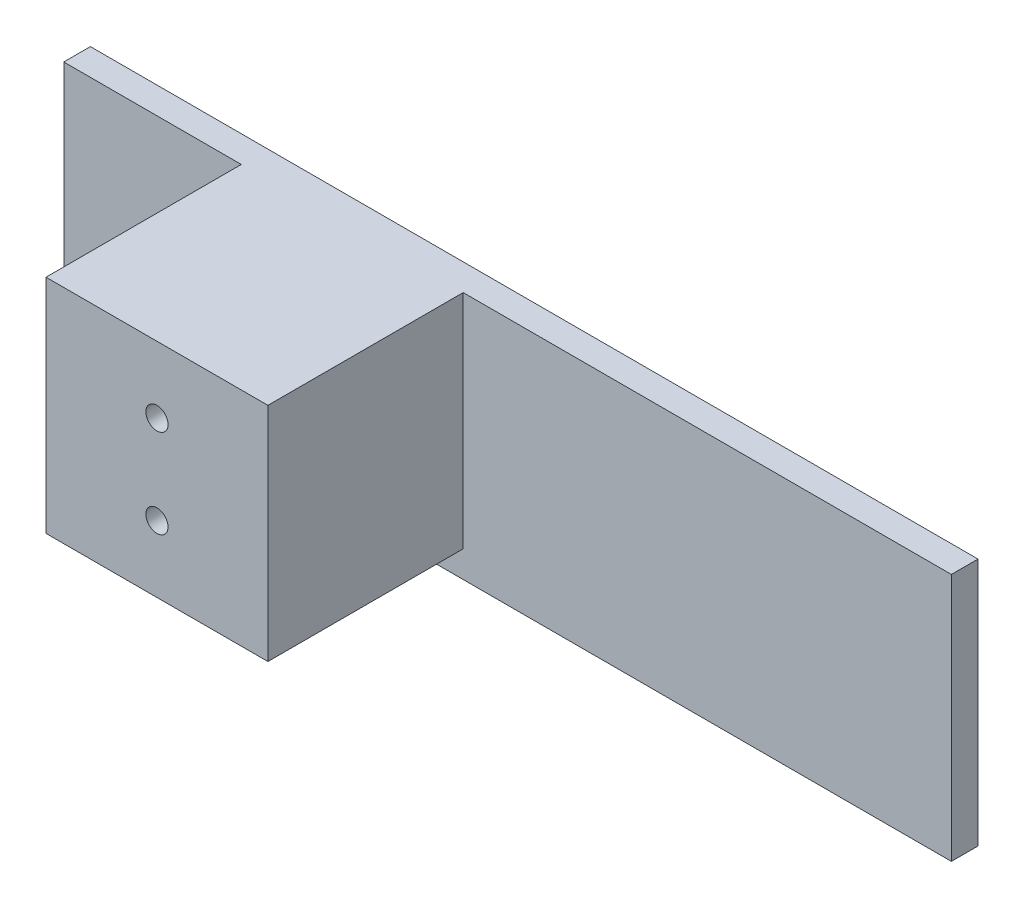
ISO-10303-21;
HEADER;
FILE_DESCRIPTION(('STEP AP214'),'2;1');
FILE_NAME('part.step','',(''),(''),'','','');
FILE_SCHEMA(('AUTOMOTIVE_DESIGN { 1 0 10303 214 1 1 1 1 }'));
ENDSEC;
DATA;
#1=APPLICATION_CONTEXT('core data for automotive mechanical design processes');
#2=APPLICATION_PROTOCOL_DEFINITION('international standard','automotive_design',2000,#1);
#3=PRODUCT_CONTEXT('',#1,'mechanical');
#4=PRODUCT('Part','Part','',(#3));
#5=PRODUCT_RELATED_PRODUCT_CATEGORY('part','',(#4));
#6=PRODUCT_DEFINITION_FORMATION('','',#4);
#7=PRODUCT_DEFINITION_CONTEXT('part definition',#1,'design');
#8=PRODUCT_DEFINITION('design','',#6,#7);
#9=PRODUCT_DEFINITION_SHAPE('','',#8);
#10=(LENGTH_UNIT() NAMED_UNIT(*) SI_UNIT(.MILLI.,.METRE.));
#11=(NAMED_UNIT(*) PLANE_ANGLE_UNIT() SI_UNIT($,.RADIAN.));
#12=(NAMED_UNIT(*) SI_UNIT($,.STERADIAN.) SOLID_ANGLE_UNIT());
#13=UNCERTAINTY_MEASURE_WITH_UNIT(LENGTH_MEASURE(1.E-05),#10,'distance_accuracy_value','');
#14=(GEOMETRIC_REPRESENTATION_CONTEXT(3) GLOBAL_UNCERTAINTY_ASSIGNED_CONTEXT((#13)) GLOBAL_UNIT_ASSIGNED_CONTEXT((#10,
#11,#12)) REPRESENTATION_CONTEXT('',''));
#15=CARTESIAN_POINT('',(0.,0.,0.));
#16=DIRECTION('',(0.,0.,1.));
#17=DIRECTION('',(1.,0.,0.));
#18=AXIS2_PLACEMENT_3D('',#15,#16,#17);
#19=CARTESIAN_POINT('',(-17.2348484848485,13.2575757575758,22.));
#20=DIRECTION('',(1.,0.,0.));
#21=DIRECTION('',(0.,0.,-1.));
#22=AXIS2_PLACEMENT_3D('',#19,#20,#21);
#23=PLANE('',#22);
#24=DIRECTION('',(0.,-1.,0.));
#25=VECTOR('',#24,1.);
#26=CARTESIAN_POINT('',(-17.2348484848485,13.2575757575758,0.));
#27=LINE('',#26,#25);
#28=CARTESIAN_POINT('',(-17.2348484848485,13.2575757575758,0.));
#29=VERTEX_POINT('',#28);
#30=CARTESIAN_POINT('',(-17.2348484848485,-11.7424242424242,0.));
#31=VERTEX_POINT('',#30);
#32=EDGE_CURVE('E133',#29,#31,#27,.T.);
#33=ORIENTED_EDGE('',*,*,#32,.T.);
#34=DIRECTION('',(0.,0.,-1.));
#35=VECTOR('',#34,1.);
#36=CARTESIAN_POINT('',(-17.2348484848485,-11.7424242424242,22.));
#37=LINE('',#36,#35);
#38=CARTESIAN_POINT('',(-17.2348484848485,-11.7424242424242,22.));
#39=VERTEX_POINT('',#38);
#40=EDGE_CURVE('E11',#39,#31,#37,.T.);
#41=ORIENTED_EDGE('',*,*,#40,.F.);
#42=DIRECTION('',(0.,-1.,0.));
#43=VECTOR('',#42,1.);
#44=CARTESIAN_POINT('',(-17.2348484848485,13.2575757575758,22.));
#45=LINE('',#44,#43);
#46=CARTESIAN_POINT('',(-17.2348484848485,13.2575757575758,22.));
#47=VERTEX_POINT('',#46);
#48=EDGE_CURVE('E139',#47,#39,#45,.T.);
#49=ORIENTED_EDGE('',*,*,#48,.F.);
#50=DIRECTION('',(0.,0.,-1.));
#51=VECTOR('',#50,1.);
#52=CARTESIAN_POINT('',(-17.2348484848485,13.2575757575758,22.));
#53=LINE('',#52,#51);
#54=EDGE_CURVE('E147',#47,#29,#53,.T.);
#55=ORIENTED_EDGE('',*,*,#54,.T.);
#56=EDGE_LOOP('',(#33,#41,#49,#55));
#57=FACE_BOUND('',#56,.T.);
#58=ADVANCED_FACE('F34',(#57),#23,.F.);
#59=CARTESIAN_POINT('',(-17.2348484848485,-11.7424242424242,22.));
#60=DIRECTION('',(0.,1.,0.));
#61=DIRECTION('',(0.,0.,1.));
#62=AXIS2_PLACEMENT_3D('',#59,#60,#61);
#63=PLANE('',#62);
#64=DIRECTION('',(1.,0.,0.));
#65=VECTOR('',#64,1.);
#66=CARTESIAN_POINT('',(-17.2348484848485,-11.7424242424242,0.));
#67=LINE('',#66,#65);
#68=CARTESIAN_POINT('',(7.76515151515152,-11.7424242424242,0.));
#69=VERTEX_POINT('',#68);
#70=EDGE_CURVE('E150',#31,#69,#67,.T.);
#71=ORIENTED_EDGE('',*,*,#70,.T.);
#72=DIRECTION('',(0.,0.,-1.));
#73=VECTOR('',#72,1.);
#74=CARTESIAN_POINT('',(7.76515151515152,-11.7424242424242,22.));
#75=LINE('',#74,#73);
#76=CARTESIAN_POINT('',(7.76515151515152,-11.7424242424242,22.));
#77=VERTEX_POINT('',#76);
#78=EDGE_CURVE('E42',#77,#69,#75,.T.);
#79=ORIENTED_EDGE('',*,*,#78,.F.);
#80=DIRECTION('',(1.,0.,0.));
#81=VECTOR('',#80,1.);
#82=CARTESIAN_POINT('',(-17.2348484848485,-11.7424242424242,22.));
#83=LINE('',#82,#81);
#84=EDGE_CURVE('E141',#39,#77,#83,.T.);
#85=ORIENTED_EDGE('',*,*,#84,.F.);
#86=ORIENTED_EDGE('',*,*,#40,.T.);
#87=EDGE_LOOP('',(#71,#79,#85,#86));
#88=FACE_BOUND('',#87,.T.);
#89=ADVANCED_FACE('F166',(#88),#63,.F.);
#90=CARTESIAN_POINT('',(7.76515151515151,13.2575757575758,22.));
#91=DIRECTION('',(-1.,0.,0.));
#92=DIRECTION('',(0.,-1.,0.));
#93=AXIS2_PLACEMENT_3D('',#90,#91,#92);
#94=PLANE('',#93);
#95=DIRECTION('',(0.,1.,0.));
#96=VECTOR('',#95,1.);
#97=CARTESIAN_POINT('',(7.76515151515151,13.2575757575758,0.));
#98=LINE('',#97,#96);
#99=CARTESIAN_POINT('',(7.76515151515152,13.2575757575757,0.));
#100=VERTEX_POINT('',#99);
#101=EDGE_CURVE('E142',#69,#100,#98,.T.);
#102=ORIENTED_EDGE('',*,*,#101,.T.);
#103=DIRECTION('',(0.,0.,-1.));
#104=VECTOR('',#103,1.);
#105=CARTESIAN_POINT('',(7.76515151515151,13.2575757575758,22.));
#106=LINE('',#105,#104);
#107=CARTESIAN_POINT('',(7.76515151515151,13.2575757575758,22.));
#108=VERTEX_POINT('',#107);
#109=EDGE_CURVE('E157',#108,#100,#106,.T.);
#110=ORIENTED_EDGE('',*,*,#109,.F.);
#111=DIRECTION('',(0.,1.,0.));
#112=VECTOR('',#111,1.);
#113=CARTESIAN_POINT('',(7.76515151515151,13.2575757575758,22.));
#114=LINE('',#113,#112);
#115=EDGE_CURVE('E144',#77,#108,#114,.T.);
#116=ORIENTED_EDGE('',*,*,#115,.F.);
#117=ORIENTED_EDGE('',*,*,#78,.T.);
#118=EDGE_LOOP('',(#102,#110,#116,#117));
#119=FACE_BOUND('',#118,.T.);
#120=ADVANCED_FACE('F162',(#119),#94,.F.);
#121=CARTESIAN_POINT('',(-17.2348484848485,13.2575757575758,22.));
#122=DIRECTION('',(0.,-1.,0.));
#123=DIRECTION('',(0.,0.,-1.));
#124=AXIS2_PLACEMENT_3D('',#121,#122,#123);
#125=PLANE('',#124);
#126=ORIENTED_EDGE('',*,*,#109,.T.);
#127=DIRECTION('',(1.,0.,0.));
#128=VECTOR('',#127,1.);
#129=CARTESIAN_POINT('',(-37.2348484848485,13.2575757575758,0.));
#130=LINE('',#129,#128);
#131=CARTESIAN_POINT('',(62.7651515151515,13.2575757575757,0.));
#132=VERTEX_POINT('',#131);
#133=EDGE_CURVE('E171',#100,#132,#130,.T.);
#134=ORIENTED_EDGE('',*,*,#133,.T.);
#135=DIRECTION('',(0.,0.,1.));
#136=VECTOR('',#135,1.);
#137=CARTESIAN_POINT('',(62.7651515151515,13.2575757575757,-3.));
#138=LINE('',#137,#136);
#139=CARTESIAN_POINT('',(62.7651515151515,13.2575757575757,-3.));
#140=VERTEX_POINT('',#139);
#141=EDGE_CURVE('E103',#140,#132,#138,.T.);
#142=ORIENTED_EDGE('',*,*,#141,.F.);
#143=DIRECTION('',(1.,0.,0.));
#144=VECTOR('',#143,1.);
#145=CARTESIAN_POINT('',(-37.2348484848485,13.2575757575758,-3.));
#146=LINE('',#145,#144);
#147=CARTESIAN_POINT('',(-37.2348484848485,13.2575757575758,-3.));
#148=VERTEX_POINT('',#147);
#149=EDGE_CURVE('E94',#148,#140,#146,.T.);
#150=ORIENTED_EDGE('',*,*,#149,.F.);
#151=DIRECTION('',(0.,0.,1.));
#152=VECTOR('',#151,1.);
#153=CARTESIAN_POINT('',(-37.2348484848485,13.2575757575758,-3.));
#154=LINE('',#153,#152);
#155=CARTESIAN_POINT('',(-37.2348484848485,13.2575757575758,0.));
#156=VERTEX_POINT('',#155);
#157=EDGE_CURVE('E100',#148,#156,#154,.T.);
#158=ORIENTED_EDGE('',*,*,#157,.T.);
#159=EDGE_CURVE('E174',#156,#29,#130,.T.);
#160=ORIENTED_EDGE('',*,*,#159,.T.);
#161=ORIENTED_EDGE('',*,*,#54,.F.);
#162=DIRECTION('',(-1.,0.,0.));
#163=VECTOR('',#162,1.);
#164=CARTESIAN_POINT('',(-17.2348484848485,13.2575757575758,22.));
#165=LINE('',#164,#163);
#166=EDGE_CURVE('E49',#108,#47,#165,.T.);
#167=ORIENTED_EDGE('',*,*,#166,.F.);
#168=EDGE_LOOP('',(#126,#134,#142,#150,#158,#160,#161,#167));
#169=FACE_BOUND('',#168,.T.);
#170=ADVANCED_FACE('F97',(#169),#125,.F.);
#171=CARTESIAN_POINT('',(0.,0.,22.));
#172=DIRECTION('',(0.,0.,1.));
#173=DIRECTION('',(1.,0.,0.));
#174=AXIS2_PLACEMENT_3D('',#171,#172,#173);
#175=PLANE('',#174);
#176=CARTESIAN_POINT('',(-4.73484848484849,5.75757575757576,22.));
#177=DIRECTION('',(0.,0.,1.));
#178=DIRECTION('',(1.,0.,0.));
#179=AXIS2_PLACEMENT_3D('',#176,#177,#178);
#180=CIRCLE('',#179,1.25);
#181=CARTESIAN_POINT('',(-3.48484848484849,5.75757575757576,22.));
#182=VERTEX_POINT('',#181);
#183=EDGE_CURVE('E134',#182,#182,#180,.T.);
#184=ORIENTED_EDGE('',*,*,#183,.F.);
#185=EDGE_LOOP('',(#184));
#186=FACE_BOUND('',#185,.T.);
#187=CARTESIAN_POINT('',(-4.73484848484848,-4.24242424242424,22.));
#188=DIRECTION('',(0.,0.,1.));
#189=DIRECTION('',(1.,0.,0.));
#190=AXIS2_PLACEMENT_3D('',#187,#188,#189);
#191=CIRCLE('',#190,1.25);
#192=CARTESIAN_POINT('',(-3.48484848484848,-4.24242424242424,22.));
#193=VERTEX_POINT('',#192);
#194=EDGE_CURVE('E121',#193,#193,#191,.T.);
#195=ORIENTED_EDGE('',*,*,#194,.F.);
#196=EDGE_LOOP('',(#195));
#197=FACE_BOUND('',#196,.T.);
#198=ORIENTED_EDGE('',*,*,#48,.T.);
#199=ORIENTED_EDGE('',*,*,#84,.T.);
#200=ORIENTED_EDGE('',*,*,#115,.T.);
#201=ORIENTED_EDGE('',*,*,#166,.T.);
#202=EDGE_LOOP('',(#198,#199,#200,#201));
#203=FACE_BOUND('',#202,.T.);
#204=ADVANCED_FACE('F189',(#186,#197,#203),#175,.T.);
#205=CARTESIAN_POINT('',(-4.73484848484848,-4.24242424242424,7.));
#206=DIRECTION('',(0.,0.,1.));
#207=DIRECTION('',(1.,0.,0.));
#208=AXIS2_PLACEMENT_3D('',#205,#206,#207);
#209=CYLINDRICAL_SURFACE('',#208,1.25);
#210=CARTESIAN_POINT('',(-4.73484848484848,-4.24242424242424,7.));
#211=DIRECTION('',(0.,0.,1.));
#212=DIRECTION('',(1.,0.,0.));
#213=AXIS2_PLACEMENT_3D('',#210,#211,#212);
#214=CIRCLE('',#213,1.25);
#215=CARTESIAN_POINT('',(-3.48484848484848,-4.24242424242424,7.));
#216=VERTEX_POINT('',#215);
#217=EDGE_CURVE('E124',#216,#216,#214,.T.);
#218=ORIENTED_EDGE('',*,*,#217,.F.);
#219=EDGE_LOOP('',(#218));
#220=FACE_BOUND('',#219,.T.);
#221=ORIENTED_EDGE('',*,*,#194,.T.);
#222=EDGE_LOOP('',(#221));
#223=FACE_BOUND('',#222,.T.);
#224=ADVANCED_FACE('F191',(#220,#223),#209,.F.);
#225=CARTESIAN_POINT('',(-4.73484848484848,-4.24242424242424,7.));
#226=DIRECTION('',(0.,0.,1.));
#227=DIRECTION('',(1.,0.,0.));
#228=AXIS2_PLACEMENT_3D('',#225,#226,#227);
#229=PLANE('',#228);
#230=ORIENTED_EDGE('',*,*,#217,.T.);
#231=EDGE_LOOP('',(#230));
#232=FACE_BOUND('',#231,.T.);
#233=ADVANCED_FACE('F198',(#232),#229,.T.);
#234=CARTESIAN_POINT('',(-4.73484848484849,5.75757575757576,7.));
#235=DIRECTION('',(0.,0.,1.));
#236=DIRECTION('',(1.,0.,0.));
#237=AXIS2_PLACEMENT_3D('',#234,#235,#236);
#238=CYLINDRICAL_SURFACE('',#237,1.25);
#239=CARTESIAN_POINT('',(-4.73484848484849,5.75757575757576,7.));
#240=DIRECTION('',(0.,0.,1.));
#241=DIRECTION('',(1.,0.,0.));
#242=AXIS2_PLACEMENT_3D('',#239,#240,#241);
#243=CIRCLE('',#242,1.25);
#244=CARTESIAN_POINT('',(-3.48484848484849,5.75757575757576,7.));
#245=VERTEX_POINT('',#244);
#246=EDGE_CURVE('E130',#245,#245,#243,.T.);
#247=ORIENTED_EDGE('',*,*,#246,.F.);
#248=EDGE_LOOP('',(#247));
#249=FACE_BOUND('',#248,.T.);
#250=ORIENTED_EDGE('',*,*,#183,.T.);
#251=EDGE_LOOP('',(#250));
#252=FACE_BOUND('',#251,.T.);
#253=ADVANCED_FACE('F269',(#249,#252),#238,.F.);
#254=CARTESIAN_POINT('',(-4.73484848484849,5.75757575757576,7.));
#255=DIRECTION('',(0.,0.,1.));
#256=DIRECTION('',(1.,0.,0.));
#257=AXIS2_PLACEMENT_3D('',#254,#255,#256);
#258=PLANE('',#257);
#259=ORIENTED_EDGE('',*,*,#246,.T.);
#260=EDGE_LOOP('',(#259));
#261=FACE_BOUND('',#260,.T.);
#262=ADVANCED_FACE('F230',(#261),#258,.T.);
#263=CARTESIAN_POINT('',(-37.2348484848485,-14.7424242424242,-3.));
#264=DIRECTION('',(1.,0.,0.));
#265=DIRECTION('',(0.,1.,0.));
#266=AXIS2_PLACEMENT_3D('',#263,#264,#265);
#267=PLANE('',#266);
#268=DIRECTION('',(0.,1.,0.));
#269=VECTOR('',#268,1.);
#270=CARTESIAN_POINT('',(-37.2348484848485,-14.7424242424242,0.));
#271=LINE('',#270,#269);
#272=CARTESIAN_POINT('',(-37.2348484848485,-14.7424242424242,0.));
#273=VERTEX_POINT('',#272);
#274=EDGE_CURVE('E120',#273,#156,#271,.T.);
#275=ORIENTED_EDGE('',*,*,#274,.T.);
#276=ORIENTED_EDGE('',*,*,#157,.F.);
#277=DIRECTION('',(0.,1.,0.));
#278=VECTOR('',#277,1.);
#279=CARTESIAN_POINT('',(-37.2348484848485,-14.7424242424242,-3.));
#280=LINE('',#279,#278);
#281=CARTESIAN_POINT('',(-37.2348484848485,-14.7424242424242,-3.));
#282=VERTEX_POINT('',#281);
#283=EDGE_CURVE('E107',#282,#148,#280,.T.);
#284=ORIENTED_EDGE('',*,*,#283,.F.);
#285=DIRECTION('',(0.,0.,1.));
#286=VECTOR('',#285,1.);
#287=CARTESIAN_POINT('',(-37.2348484848485,-14.7424242424242,-3.));
#288=LINE('',#287,#286);
#289=EDGE_CURVE('E181',#282,#273,#288,.T.);
#290=ORIENTED_EDGE('',*,*,#289,.T.);
#291=EDGE_LOOP('',(#275,#276,#284,#290));
#292=FACE_BOUND('',#291,.T.);
#293=ADVANCED_FACE('F118',(#292),#267,.F.);
#294=CARTESIAN_POINT('',(62.7651515151515,-14.7424242424243,-3.));
#295=DIRECTION('',(-1.,0.,0.));
#296=DIRECTION('',(0.,0.,1.));
#297=AXIS2_PLACEMENT_3D('',#294,#295,#296);
#298=PLANE('',#297);
#299=DIRECTION('',(0.,-1.,0.));
#300=VECTOR('',#299,1.);
#301=CARTESIAN_POINT('',(62.7651515151515,-14.7424242424243,0.));
#302=LINE('',#301,#300);
#303=CARTESIAN_POINT('',(62.7651515151515,-14.7424242424243,0.));
#304=VERTEX_POINT('',#303);
#305=EDGE_CURVE('E173',#132,#304,#302,.T.);
#306=ORIENTED_EDGE('',*,*,#305,.T.);
#307=DIRECTION('',(0.,0.,1.));
#308=VECTOR('',#307,1.);
#309=CARTESIAN_POINT('',(62.7651515151515,-14.7424242424243,-3.));
#310=LINE('',#309,#308);
#311=CARTESIAN_POINT('',(62.7651515151515,-14.7424242424243,-3.));
#312=VERTEX_POINT('',#311);
#313=EDGE_CURVE('E126',#312,#304,#310,.T.);
#314=ORIENTED_EDGE('',*,*,#313,.F.);
#315=DIRECTION('',(0.,-1.,0.));
#316=VECTOR('',#315,1.);
#317=CARTESIAN_POINT('',(62.7651515151515,-14.7424242424243,-3.));
#318=LINE('',#317,#316);
#319=EDGE_CURVE('E106',#140,#312,#318,.T.);
#320=ORIENTED_EDGE('',*,*,#319,.F.);
#321=ORIENTED_EDGE('',*,*,#141,.T.);
#322=EDGE_LOOP('',(#306,#314,#320,#321));
#323=FACE_BOUND('',#322,.T.);
#324=ADVANCED_FACE('F229',(#323),#298,.F.);
#325=CARTESIAN_POINT('',(-37.2348484848485,-14.7424242424242,-3.));
#326=DIRECTION('',(0.,1.,0.));
#327=DIRECTION('',(-1.,0.,0.));
#328=AXIS2_PLACEMENT_3D('',#325,#326,#327);
#329=PLANE('',#328);
#330=DIRECTION('',(-1.,0.,0.));
#331=VECTOR('',#330,1.);
#332=CARTESIAN_POINT('',(-37.2348484848485,-14.7424242424242,0.));
#333=LINE('',#332,#331);
#334=EDGE_CURVE('E116',#304,#273,#333,.T.);
#335=ORIENTED_EDGE('',*,*,#334,.T.);
#336=ORIENTED_EDGE('',*,*,#289,.F.);
#337=DIRECTION('',(-1.,0.,0.));
#338=VECTOR('',#337,1.);
#339=CARTESIAN_POINT('',(-37.2348484848485,-14.7424242424242,-3.));
#340=LINE('',#339,#338);
#341=EDGE_CURVE('E112',#312,#282,#340,.T.);
#342=ORIENTED_EDGE('',*,*,#341,.F.);
#343=ORIENTED_EDGE('',*,*,#313,.T.);
#344=EDGE_LOOP('',(#335,#336,#342,#343));
#345=FACE_BOUND('',#344,.T.);
#346=ADVANCED_FACE('F185',(#345),#329,.F.);
#347=CARTESIAN_POINT('',(0.,0.,-3.));
#348=DIRECTION('',(0.,0.,-1.));
#349=DIRECTION('',(-1.,0.,0.));
#350=AXIS2_PLACEMENT_3D('',#347,#348,#349);
#351=PLANE('',#350);
#352=ORIENTED_EDGE('',*,*,#283,.T.);
#353=ORIENTED_EDGE('',*,*,#149,.T.);
#354=ORIENTED_EDGE('',*,*,#319,.T.);
#355=ORIENTED_EDGE('',*,*,#341,.T.);
#356=EDGE_LOOP('',(#352,#353,#354,#355));
#357=FACE_BOUND('',#356,.T.);
#358=ADVANCED_FACE('F110',(#357),#351,.T.);
#359=CARTESIAN_POINT('',(0.,0.,0.));
#360=DIRECTION('',(0.,0.,-1.));
#361=DIRECTION('',(-1.,0.,0.));
#362=AXIS2_PLACEMENT_3D('',#359,#360,#361);
#363=PLANE('',#362);
#364=ORIENTED_EDGE('',*,*,#32,.F.);
#365=ORIENTED_EDGE('',*,*,#159,.F.);
#366=ORIENTED_EDGE('',*,*,#274,.F.);
#367=ORIENTED_EDGE('',*,*,#334,.F.);
#368=ORIENTED_EDGE('',*,*,#305,.F.);
#369=ORIENTED_EDGE('',*,*,#133,.F.);
#370=ORIENTED_EDGE('',*,*,#101,.F.);
#371=ORIENTED_EDGE('',*,*,#70,.F.);
#372=EDGE_LOOP('',(#364,#365,#366,#367,#368,#369,#370,#371));
#373=FACE_BOUND('',#372,.T.);
#374=ADVANCED_FACE('F169',(#373),#363,.F.);
#375=CLOSED_SHELL('',(#58,#89,#120,#170,#204,#224,#233,#253,#262,#293,#324,#346,#358,#374));
#376=MANIFOLD_SOLID_BREP('B2',#375);
#377=ADVANCED_BREP_SHAPE_REPRESENTATION('',(#18,#376),#14);
#378=SHAPE_DEFINITION_REPRESENTATION(#9,#377);
ENDSEC;
END-ISO-10303-21;
